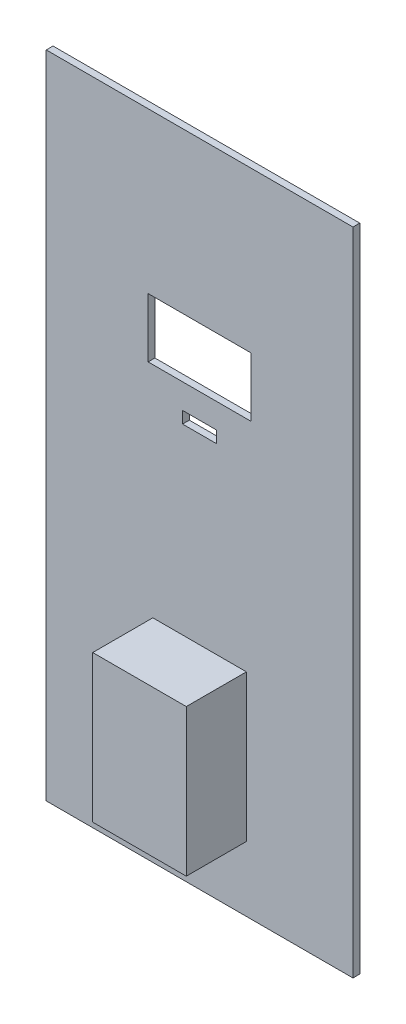
ISO-10303-21;
HEADER;
FILE_DESCRIPTION(('STEP AP214'),'2;1');
FILE_NAME('part.step','',(''),(''),'','','');
FILE_SCHEMA(('AUTOMOTIVE_DESIGN { 1 0 10303 214 1 1 1 1 }'));
ENDSEC;
DATA;
#1=APPLICATION_CONTEXT('core data for automotive mechanical design processes');
#2=APPLICATION_PROTOCOL_DEFINITION('international standard','automotive_design',2000,#1);
#3=PRODUCT_CONTEXT('',#1,'mechanical');
#4=PRODUCT('Part','Part','',(#3));
#5=PRODUCT_RELATED_PRODUCT_CATEGORY('part','',(#4));
#6=PRODUCT_DEFINITION_FORMATION('','',#4);
#7=PRODUCT_DEFINITION_CONTEXT('part definition',#1,'design');
#8=PRODUCT_DEFINITION('design','',#6,#7);
#9=PRODUCT_DEFINITION_SHAPE('','',#8);
#10=(LENGTH_UNIT() NAMED_UNIT(*) SI_UNIT(.MILLI.,.METRE.));
#11=(NAMED_UNIT(*) PLANE_ANGLE_UNIT() SI_UNIT($,.RADIAN.));
#12=(NAMED_UNIT(*) SI_UNIT($,.STERADIAN.) SOLID_ANGLE_UNIT());
#13=UNCERTAINTY_MEASURE_WITH_UNIT(LENGTH_MEASURE(1.E-05),#10,'distance_accuracy_value','');
#14=(GEOMETRIC_REPRESENTATION_CONTEXT(3) GLOBAL_UNCERTAINTY_ASSIGNED_CONTEXT((#13)) GLOBAL_UNIT_ASSIGNED_CONTEXT((#10,
#11,#12)) REPRESENTATION_CONTEXT('',''));
#15=CARTESIAN_POINT('',(0.,0.,0.));
#16=DIRECTION('',(0.,0.,1.));
#17=DIRECTION('',(1.,0.,0.));
#18=AXIS2_PLACEMENT_3D('',#15,#16,#17);
#19=CARTESIAN_POINT('',(0.,0.,12.7));
#20=DIRECTION('',(0.,0.,1.));
#21=DIRECTION('',(1.,0.,0.));
#22=AXIS2_PLACEMENT_3D('',#19,#20,#21);
#23=PLANE('',#22);
#24=DIRECTION('',(0.,1.,0.));
#25=VECTOR('',#24,1.);
#26=CARTESIAN_POINT('',(287.5,609.6,12.7));
#27=LINE('',#26,#25);
#28=CARTESIAN_POINT('',(287.5,-609.6,12.7));
#29=VERTEX_POINT('',#28);
#30=CARTESIAN_POINT('',(287.5,609.6,12.7));
#31=VERTEX_POINT('',#30);
#32=EDGE_CURVE('E307',#29,#31,#27,.T.);
#33=ORIENTED_EDGE('',*,*,#32,.T.);
#34=DIRECTION('',(-1.,0.,0.));
#35=VECTOR('',#34,1.);
#36=CARTESIAN_POINT('',(-287.5,609.6,12.7));
#37=LINE('',#36,#35);
#38=CARTESIAN_POINT('',(-287.5,609.6,12.7));
#39=VERTEX_POINT('',#38);
#40=EDGE_CURVE('E310',#31,#39,#37,.T.);
#41=ORIENTED_EDGE('',*,*,#40,.T.);
#42=DIRECTION('',(0.,-1.,0.));
#43=VECTOR('',#42,1.);
#44=CARTESIAN_POINT('',(-287.5,609.6,12.7));
#45=LINE('',#44,#43);
#46=CARTESIAN_POINT('',(-287.5,-609.6,12.7));
#47=VERTEX_POINT('',#46);
#48=EDGE_CURVE('E313',#39,#47,#45,.T.);
#49=ORIENTED_EDGE('',*,*,#48,.T.);
#50=DIRECTION('',(1.,0.,0.));
#51=VECTOR('',#50,1.);
#52=CARTESIAN_POINT('',(-287.5,-609.6,12.7));
#53=LINE('',#52,#51);
#54=EDGE_CURVE('E315',#47,#29,#53,.T.);
#55=ORIENTED_EDGE('',*,*,#54,.T.);
#56=EDGE_LOOP('',(#33,#41,#49,#55));
#57=FACE_BOUND('',#56,.T.);
#58=DIRECTION('',(0.,-1.,0.));
#59=VECTOR('',#58,1.);
#60=CARTESIAN_POINT('',(-32.,152.128454097859,12.7));
#61=LINE('',#60,#59);
#62=CARTESIAN_POINT('',(-32.,152.128454097859,12.7));
#63=VERTEX_POINT('',#62);
#64=CARTESIAN_POINT('',(-32.,129.938454097859,12.7));
#65=VERTEX_POINT('',#64);
#66=EDGE_CURVE('E237',#63,#65,#61,.T.);
#67=ORIENTED_EDGE('',*,*,#66,.F.);
#68=DIRECTION('',(-1.,0.,0.));
#69=VECTOR('',#68,1.);
#70=CARTESIAN_POINT('',(32.,152.128454097859,12.7));
#71=LINE('',#70,#69);
#72=CARTESIAN_POINT('',(32.,152.128454097859,12.7));
#73=VERTEX_POINT('',#72);
#74=EDGE_CURVE('E281',#73,#63,#71,.T.);
#75=ORIENTED_EDGE('',*,*,#74,.F.);
#76=DIRECTION('',(0.,1.,0.));
#77=VECTOR('',#76,1.);
#78=CARTESIAN_POINT('',(32.,152.128454097859,12.7));
#79=LINE('',#78,#77);
#80=CARTESIAN_POINT('',(32.,129.938454097859,12.7));
#81=VERTEX_POINT('',#80);
#82=EDGE_CURVE('E295',#81,#73,#79,.T.);
#83=ORIENTED_EDGE('',*,*,#82,.F.);
#84=DIRECTION('',(1.,0.,0.));
#85=VECTOR('',#84,1.);
#86=CARTESIAN_POINT('',(32.,129.938454097859,12.7));
#87=LINE('',#86,#85);
#88=EDGE_CURVE('E292',#65,#81,#87,.T.);
#89=ORIENTED_EDGE('',*,*,#88,.F.);
#90=EDGE_LOOP('',(#67,#75,#83,#89));
#91=FACE_BOUND('',#90,.T.);
#92=DIRECTION('',(0.,1.,0.));
#93=VECTOR('',#92,1.);
#94=CARTESIAN_POINT('',(96.5000000000003,309.6,12.7));
#95=LINE('',#94,#93);
#96=CARTESIAN_POINT('',(96.5000000000003,198.6,12.7));
#97=VERTEX_POINT('',#96);
#98=CARTESIAN_POINT('',(96.5000000000003,309.6,12.7));
#99=VERTEX_POINT('',#98);
#100=EDGE_CURVE('E257',#97,#99,#95,.T.);
#101=ORIENTED_EDGE('',*,*,#100,.F.);
#102=DIRECTION('',(1.,0.,0.));
#103=VECTOR('',#102,1.);
#104=CARTESIAN_POINT('',(-96.4999999999997,198.6,12.7));
#105=LINE('',#104,#103);
#106=CARTESIAN_POINT('',(-96.4999999999997,198.6,12.7));
#107=VERTEX_POINT('',#106);
#108=EDGE_CURVE('E247',#107,#97,#105,.T.);
#109=ORIENTED_EDGE('',*,*,#108,.F.);
#110=DIRECTION('',(0.,-1.,0.));
#111=VECTOR('',#110,1.);
#112=CARTESIAN_POINT('',(-96.4999999999997,309.6,12.7));
#113=LINE('',#112,#111);
#114=CARTESIAN_POINT('',(-96.4999999999997,309.6,12.7));
#115=VERTEX_POINT('',#114);
#116=EDGE_CURVE('E263',#115,#107,#113,.T.);
#117=ORIENTED_EDGE('',*,*,#116,.F.);
#118=DIRECTION('',(-1.,0.,0.));
#119=VECTOR('',#118,1.);
#120=CARTESIAN_POINT('',(-96.4999999999997,309.6,12.7));
#121=LINE('',#120,#119);
#122=EDGE_CURVE('E259',#99,#115,#121,.T.);
#123=ORIENTED_EDGE('',*,*,#122,.F.);
#124=EDGE_LOOP('',(#101,#109,#117,#123));
#125=FACE_BOUND('',#124,.T.);
#126=DIRECTION('',(-1.,0.,0.));
#127=VECTOR('',#126,1.);
#128=CARTESIAN_POINT('',(-87.7000000000001,-212.463151910819,12.7));
#129=LINE('',#128,#127);
#130=CARTESIAN_POINT('',(87.6999999999999,-212.463151910819,12.7));
#131=VERTEX_POINT('',#130);
#132=CARTESIAN_POINT('',(-87.7000000000001,-212.463151910819,12.7));
#133=VERTEX_POINT('',#132);
#134=EDGE_CURVE('E214',#131,#133,#129,.T.);
#135=ORIENTED_EDGE('',*,*,#134,.F.);
#136=DIRECTION('',(0.,1.,0.));
#137=VECTOR('',#136,1.);
#138=CARTESIAN_POINT('',(87.6999999999999,-212.463151910819,12.7));
#139=LINE('',#138,#137);
#140=CARTESIAN_POINT('',(87.6999999999999,-487.863151910819,12.7));
#141=VERTEX_POINT('',#140);
#142=EDGE_CURVE('E180',#141,#131,#139,.T.);
#143=ORIENTED_EDGE('',*,*,#142,.F.);
#144=DIRECTION('',(1.,0.,0.));
#145=VECTOR('',#144,1.);
#146=CARTESIAN_POINT('',(87.6999999999999,-487.863151910819,12.7));
#147=LINE('',#146,#145);
#148=CARTESIAN_POINT('',(-87.7000000000001,-487.863151910819,12.7));
#149=VERTEX_POINT('',#148);
#150=EDGE_CURVE('E218',#149,#141,#147,.T.);
#151=ORIENTED_EDGE('',*,*,#150,.F.);
#152=DIRECTION('',(0.,-1.,0.));
#153=VECTOR('',#152,1.);
#154=CARTESIAN_POINT('',(-87.7000000000001,-487.863151910819,12.7));
#155=LINE('',#154,#153);
#156=EDGE_CURVE('E216',#133,#149,#155,.T.);
#157=ORIENTED_EDGE('',*,*,#156,.F.);
#158=EDGE_LOOP('',(#135,#143,#151,#157));
#159=FACE_BOUND('',#158,.T.);
#160=ADVANCED_FACE('F35',(#57,#91,#125,#159),#23,.T.);
#161=CARTESIAN_POINT('',(287.5,609.6,12.7));
#162=DIRECTION('',(-1.,0.,0.));
#163=DIRECTION('',(0.,-1.,0.));
#164=AXIS2_PLACEMENT_3D('',#161,#162,#163);
#165=PLANE('',#164);
#166=DIRECTION('',(0.,1.,0.));
#167=VECTOR('',#166,1.);
#168=CARTESIAN_POINT('',(287.5,609.6,0.));
#169=LINE('',#168,#167);
#170=CARTESIAN_POINT('',(287.5,-609.6,0.));
#171=VERTEX_POINT('',#170);
#172=CARTESIAN_POINT('',(287.5,609.6,0.));
#173=VERTEX_POINT('',#172);
#174=EDGE_CURVE('E270',#171,#173,#169,.T.);
#175=ORIENTED_EDGE('',*,*,#174,.T.);
#176=DIRECTION('',(0.,0.,-1.));
#177=VECTOR('',#176,1.);
#178=CARTESIAN_POINT('',(287.5,609.6,12.7));
#179=LINE('',#178,#177);
#180=EDGE_CURVE('E11',#31,#173,#179,.T.);
#181=ORIENTED_EDGE('',*,*,#180,.F.);
#182=ORIENTED_EDGE('',*,*,#32,.F.);
#183=DIRECTION('',(0.,0.,-1.));
#184=VECTOR('',#183,1.);
#185=CARTESIAN_POINT('',(287.5,-609.6,12.7));
#186=LINE('',#185,#184);
#187=EDGE_CURVE('E317',#29,#171,#186,.T.);
#188=ORIENTED_EDGE('',*,*,#187,.T.);
#189=EDGE_LOOP('',(#175,#181,#182,#188));
#190=FACE_BOUND('',#189,.T.);
#191=ADVANCED_FACE('F37',(#190),#165,.F.);
#192=CARTESIAN_POINT('',(-287.5,609.6,12.7));
#193=DIRECTION('',(0.,-1.,0.));
#194=DIRECTION('',(0.,0.,-1.));
#195=AXIS2_PLACEMENT_3D('',#192,#193,#194);
#196=PLANE('',#195);
#197=DIRECTION('',(-1.,0.,0.));
#198=VECTOR('',#197,1.);
#199=CARTESIAN_POINT('',(-287.5,609.6,0.));
#200=LINE('',#199,#198);
#201=CARTESIAN_POINT('',(-287.5,609.6,0.));
#202=VERTEX_POINT('',#201);
#203=EDGE_CURVE('E320',#173,#202,#200,.T.);
#204=ORIENTED_EDGE('',*,*,#203,.T.);
#205=DIRECTION('',(0.,0.,-1.));
#206=VECTOR('',#205,1.);
#207=CARTESIAN_POINT('',(-287.5,609.6,12.7));
#208=LINE('',#207,#206);
#209=EDGE_CURVE('E43',#39,#202,#208,.T.);
#210=ORIENTED_EDGE('',*,*,#209,.F.);
#211=ORIENTED_EDGE('',*,*,#40,.F.);
#212=ORIENTED_EDGE('',*,*,#180,.T.);
#213=EDGE_LOOP('',(#204,#210,#211,#212));
#214=FACE_BOUND('',#213,.T.);
#215=ADVANCED_FACE('F350',(#214),#196,.F.);
#216=CARTESIAN_POINT('',(-287.5,609.6,12.7));
#217=DIRECTION('',(1.,0.,0.));
#218=DIRECTION('',(0.,1.,0.));
#219=AXIS2_PLACEMENT_3D('',#216,#217,#218);
#220=PLANE('',#219);
#221=DIRECTION('',(0.,-1.,0.));
#222=VECTOR('',#221,1.);
#223=CARTESIAN_POINT('',(-287.5,609.6,0.));
#224=LINE('',#223,#222);
#225=CARTESIAN_POINT('',(-287.5,-609.6,0.));
#226=VERTEX_POINT('',#225);
#227=EDGE_CURVE('E322',#202,#226,#224,.T.);
#228=ORIENTED_EDGE('',*,*,#227,.T.);
#229=DIRECTION('',(0.,0.,-1.));
#230=VECTOR('',#229,1.);
#231=CARTESIAN_POINT('',(-287.5,-609.6,12.7));
#232=LINE('',#231,#230);
#233=EDGE_CURVE('E327',#47,#226,#232,.T.);
#234=ORIENTED_EDGE('',*,*,#233,.F.);
#235=ORIENTED_EDGE('',*,*,#48,.F.);
#236=ORIENTED_EDGE('',*,*,#209,.T.);
#237=EDGE_LOOP('',(#228,#234,#235,#236));
#238=FACE_BOUND('',#237,.T.);
#239=ADVANCED_FACE('F334',(#238),#220,.F.);
#240=CARTESIAN_POINT('',(-287.5,-609.6,12.7));
#241=DIRECTION('',(0.,1.,0.));
#242=DIRECTION('',(0.,0.,1.));
#243=AXIS2_PLACEMENT_3D('',#240,#241,#242);
#244=PLANE('',#243);
#245=DIRECTION('',(1.,0.,0.));
#246=VECTOR('',#245,1.);
#247=CARTESIAN_POINT('',(-287.5,-609.6,0.));
#248=LINE('',#247,#246);
#249=EDGE_CURVE('E311',#226,#171,#248,.T.);
#250=ORIENTED_EDGE('',*,*,#249,.T.);
#251=ORIENTED_EDGE('',*,*,#187,.F.);
#252=ORIENTED_EDGE('',*,*,#54,.F.);
#253=ORIENTED_EDGE('',*,*,#233,.T.);
#254=EDGE_LOOP('',(#250,#251,#252,#253));
#255=FACE_BOUND('',#254,.T.);
#256=ADVANCED_FACE('F343',(#255),#244,.F.);
#257=CARTESIAN_POINT('',(0.,0.,0.));
#258=DIRECTION('',(0.,0.,1.));
#259=DIRECTION('',(1.,0.,0.));
#260=AXIS2_PLACEMENT_3D('',#257,#258,#259);
#261=PLANE('',#260);
#262=DIRECTION('',(1.,0.,0.));
#263=VECTOR('',#262,1.);
#264=CARTESIAN_POINT('',(74.9999999999999,-225.163151910819,0.));
#265=LINE('',#264,#263);
#266=CARTESIAN_POINT('',(-75.0000000000001,-225.163151910819,0.));
#267=VERTEX_POINT('',#266);
#268=CARTESIAN_POINT('',(74.9999999999999,-225.163151910819,0.));
#269=VERTEX_POINT('',#268);
#270=EDGE_CURVE('E225',#267,#269,#265,.T.);
#271=ORIENTED_EDGE('',*,*,#270,.F.);
#272=DIRECTION('',(0.,1.,0.));
#273=VECTOR('',#272,1.);
#274=CARTESIAN_POINT('',(-75.0000000000001,-225.163151910819,0.));
#275=LINE('',#274,#273);
#276=CARTESIAN_POINT('',(-75.0000000000001,-475.163151910819,0.));
#277=VERTEX_POINT('',#276);
#278=EDGE_CURVE('E58',#277,#267,#275,.T.);
#279=ORIENTED_EDGE('',*,*,#278,.F.);
#280=DIRECTION('',(-1.,0.,0.));
#281=VECTOR('',#280,1.);
#282=CARTESIAN_POINT('',(74.9999999999999,-475.163151910819,0.));
#283=LINE('',#282,#281);
#284=CARTESIAN_POINT('',(74.9999999999999,-475.163151910819,0.));
#285=VERTEX_POINT('',#284);
#286=EDGE_CURVE('E231',#285,#277,#283,.T.);
#287=ORIENTED_EDGE('',*,*,#286,.F.);
#288=DIRECTION('',(0.,-1.,0.));
#289=VECTOR('',#288,1.);
#290=CARTESIAN_POINT('',(74.9999999999999,-225.163151910819,0.));
#291=LINE('',#290,#289);
#292=EDGE_CURVE('E228',#269,#285,#291,.T.);
#293=ORIENTED_EDGE('',*,*,#292,.F.);
#294=EDGE_LOOP('',(#271,#279,#287,#293));
#295=FACE_BOUND('',#294,.T.);
#296=DIRECTION('',(1.,0.,0.));
#297=VECTOR('',#296,1.);
#298=CARTESIAN_POINT('',(-96.4999999999997,198.6,0.));
#299=LINE('',#298,#297);
#300=CARTESIAN_POINT('',(-96.4999999999997,198.6,0.));
#301=VERTEX_POINT('',#300);
#302=CARTESIAN_POINT('',(96.5000000000003,198.6,0.));
#303=VERTEX_POINT('',#302);
#304=EDGE_CURVE('E253',#301,#303,#299,.T.);
#305=ORIENTED_EDGE('',*,*,#304,.T.);
#306=DIRECTION('',(0.,1.,0.));
#307=VECTOR('',#306,1.);
#308=CARTESIAN_POINT('',(96.5000000000003,309.6,0.));
#309=LINE('',#308,#307);
#310=CARTESIAN_POINT('',(96.5000000000003,309.6,0.));
#311=VERTEX_POINT('',#310);
#312=EDGE_CURVE('E243',#303,#311,#309,.T.);
#313=ORIENTED_EDGE('',*,*,#312,.T.);
#314=DIRECTION('',(-1.,0.,0.));
#315=VECTOR('',#314,1.);
#316=CARTESIAN_POINT('',(-96.4999999999997,309.6,0.));
#317=LINE('',#316,#315);
#318=CARTESIAN_POINT('',(-96.4999999999997,309.6,0.));
#319=VERTEX_POINT('',#318);
#320=EDGE_CURVE('E246',#311,#319,#317,.T.);
#321=ORIENTED_EDGE('',*,*,#320,.T.);
#322=DIRECTION('',(0.,-1.,0.));
#323=VECTOR('',#322,1.);
#324=CARTESIAN_POINT('',(-96.4999999999997,309.6,0.));
#325=LINE('',#324,#323);
#326=EDGE_CURVE('E250',#319,#301,#325,.T.);
#327=ORIENTED_EDGE('',*,*,#326,.T.);
#328=EDGE_LOOP('',(#305,#313,#321,#327));
#329=FACE_BOUND('',#328,.T.);
#330=DIRECTION('',(-1.,0.,0.));
#331=VECTOR('',#330,1.);
#332=CARTESIAN_POINT('',(32.,152.128454097859,0.));
#333=LINE('',#332,#331);
#334=CARTESIAN_POINT('',(32.,152.128454097859,0.));
#335=VERTEX_POINT('',#334);
#336=CARTESIAN_POINT('',(-32.,152.128454097859,0.));
#337=VERTEX_POINT('',#336);
#338=EDGE_CURVE('E287',#335,#337,#333,.T.);
#339=ORIENTED_EDGE('',*,*,#338,.T.);
#340=DIRECTION('',(0.,-1.,0.));
#341=VECTOR('',#340,1.);
#342=CARTESIAN_POINT('',(-32.,152.128454097859,0.));
#343=LINE('',#342,#341);
#344=CARTESIAN_POINT('',(-32.,129.938454097859,0.));
#345=VERTEX_POINT('',#344);
#346=EDGE_CURVE('E277',#337,#345,#343,.T.);
#347=ORIENTED_EDGE('',*,*,#346,.T.);
#348=DIRECTION('',(1.,0.,0.));
#349=VECTOR('',#348,1.);
#350=CARTESIAN_POINT('',(32.,129.938454097859,0.));
#351=LINE('',#350,#349);
#352=CARTESIAN_POINT('',(32.,129.938454097859,0.));
#353=VERTEX_POINT('',#352);
#354=EDGE_CURVE('E280',#345,#353,#351,.T.);
#355=ORIENTED_EDGE('',*,*,#354,.T.);
#356=DIRECTION('',(0.,1.,0.));
#357=VECTOR('',#356,1.);
#358=CARTESIAN_POINT('',(32.,152.128454097859,0.));
#359=LINE('',#358,#357);
#360=EDGE_CURVE('E284',#353,#335,#359,.T.);
#361=ORIENTED_EDGE('',*,*,#360,.T.);
#362=EDGE_LOOP('',(#339,#347,#355,#361));
#363=FACE_BOUND('',#362,.T.);
#364=ORIENTED_EDGE('',*,*,#174,.F.);
#365=ORIENTED_EDGE('',*,*,#249,.F.);
#366=ORIENTED_EDGE('',*,*,#227,.F.);
#367=ORIENTED_EDGE('',*,*,#203,.F.);
#368=EDGE_LOOP('',(#364,#365,#366,#367));
#369=FACE_BOUND('',#368,.T.);
#370=ADVANCED_FACE('F340',(#295,#329,#363,#369),#261,.F.);
#371=CARTESIAN_POINT('',(-32.,152.128454097859,0.));
#372=DIRECTION('',(-1.,0.,0.));
#373=DIRECTION('',(0.,0.,1.));
#374=AXIS2_PLACEMENT_3D('',#371,#372,#373);
#375=PLANE('',#374);
#376=ORIENTED_EDGE('',*,*,#66,.T.);
#377=DIRECTION('',(0.,0.,1.));
#378=VECTOR('',#377,1.);
#379=CARTESIAN_POINT('',(-32.,129.938454097859,0.));
#380=LINE('',#379,#378);
#381=EDGE_CURVE('E290',#345,#65,#380,.T.);
#382=ORIENTED_EDGE('',*,*,#381,.F.);
#383=ORIENTED_EDGE('',*,*,#346,.F.);
#384=DIRECTION('',(0.,0.,1.));
#385=VECTOR('',#384,1.);
#386=CARTESIAN_POINT('',(-32.,152.128454097859,0.));
#387=LINE('',#386,#385);
#388=EDGE_CURVE('E260',#337,#63,#387,.T.);
#389=ORIENTED_EDGE('',*,*,#388,.T.);
#390=EDGE_LOOP('',(#376,#382,#383,#389));
#391=FACE_BOUND('',#390,.T.);
#392=ADVANCED_FACE('F365',(#391),#375,.F.);
#393=CARTESIAN_POINT('',(32.,152.128454097859,0.));
#394=DIRECTION('',(0.,1.,0.));
#395=DIRECTION('',(0.,0.,1.));
#396=AXIS2_PLACEMENT_3D('',#393,#394,#395);
#397=PLANE('',#396);
#398=ORIENTED_EDGE('',*,*,#74,.T.);
#399=ORIENTED_EDGE('',*,*,#388,.F.);
#400=ORIENTED_EDGE('',*,*,#338,.F.);
#401=DIRECTION('',(0.,0.,1.));
#402=VECTOR('',#401,1.);
#403=CARTESIAN_POINT('',(32.,152.128454097859,0.));
#404=LINE('',#403,#402);
#405=EDGE_CURVE('E301',#335,#73,#404,.T.);
#406=ORIENTED_EDGE('',*,*,#405,.T.);
#407=EDGE_LOOP('',(#398,#399,#400,#406));
#408=FACE_BOUND('',#407,.T.);
#409=ADVANCED_FACE('F394',(#408),#397,.F.);
#410=CARTESIAN_POINT('',(32.,152.128454097859,0.));
#411=DIRECTION('',(1.,0.,0.));
#412=DIRECTION('',(0.,1.,0.));
#413=AXIS2_PLACEMENT_3D('',#410,#411,#412);
#414=PLANE('',#413);
#415=ORIENTED_EDGE('',*,*,#82,.T.);
#416=ORIENTED_EDGE('',*,*,#405,.F.);
#417=ORIENTED_EDGE('',*,*,#360,.F.);
#418=DIRECTION('',(0.,0.,1.));
#419=VECTOR('',#418,1.);
#420=CARTESIAN_POINT('',(32.,129.938454097859,0.));
#421=LINE('',#420,#419);
#422=EDGE_CURVE('E303',#353,#81,#421,.T.);
#423=ORIENTED_EDGE('',*,*,#422,.T.);
#424=EDGE_LOOP('',(#415,#416,#417,#423));
#425=FACE_BOUND('',#424,.T.);
#426=ADVANCED_FACE('F400',(#425),#414,.F.);
#427=CARTESIAN_POINT('',(32.,129.938454097859,0.));
#428=DIRECTION('',(0.,-1.,0.));
#429=DIRECTION('',(0.,0.,-1.));
#430=AXIS2_PLACEMENT_3D('',#427,#428,#429);
#431=PLANE('',#430);
#432=ORIENTED_EDGE('',*,*,#88,.T.);
#433=ORIENTED_EDGE('',*,*,#422,.F.);
#434=ORIENTED_EDGE('',*,*,#354,.F.);
#435=ORIENTED_EDGE('',*,*,#381,.T.);
#436=EDGE_LOOP('',(#432,#433,#434,#435));
#437=FACE_BOUND('',#436,.T.);
#438=ADVANCED_FACE('F408',(#437),#431,.F.);
#439=CARTESIAN_POINT('',(96.5000000000003,309.6,0.));
#440=DIRECTION('',(1.,0.,0.));
#441=DIRECTION('',(0.,1.,0.));
#442=AXIS2_PLACEMENT_3D('',#439,#440,#441);
#443=PLANE('',#442);
#444=ORIENTED_EDGE('',*,*,#100,.T.);
#445=DIRECTION('',(0.,0.,1.));
#446=VECTOR('',#445,1.);
#447=CARTESIAN_POINT('',(96.5000000000003,309.6,0.));
#448=LINE('',#447,#446);
#449=EDGE_CURVE('E256',#311,#99,#448,.T.);
#450=ORIENTED_EDGE('',*,*,#449,.F.);
#451=ORIENTED_EDGE('',*,*,#312,.F.);
#452=DIRECTION('',(0.,0.,1.));
#453=VECTOR('',#452,1.);
#454=CARTESIAN_POINT('',(96.5000000000003,198.6,0.));
#455=LINE('',#454,#453);
#456=EDGE_CURVE('E268',#303,#97,#455,.T.);
#457=ORIENTED_EDGE('',*,*,#456,.T.);
#458=EDGE_LOOP('',(#444,#450,#451,#457));
#459=FACE_BOUND('',#458,.T.);
#460=ADVANCED_FACE('F416',(#459),#443,.F.);
#461=CARTESIAN_POINT('',(-96.4999999999997,198.6,0.));
#462=DIRECTION('',(0.,-1.,0.));
#463=DIRECTION('',(0.,0.,-1.));
#464=AXIS2_PLACEMENT_3D('',#461,#462,#463);
#465=PLANE('',#464);
#466=ORIENTED_EDGE('',*,*,#108,.T.);
#467=ORIENTED_EDGE('',*,*,#456,.F.);
#468=ORIENTED_EDGE('',*,*,#304,.F.);
#469=DIRECTION('',(0.,0.,1.));
#470=VECTOR('',#469,1.);
#471=CARTESIAN_POINT('',(-96.4999999999997,198.6,0.));
#472=LINE('',#471,#470);
#473=EDGE_CURVE('E271',#301,#107,#472,.T.);
#474=ORIENTED_EDGE('',*,*,#473,.T.);
#475=EDGE_LOOP('',(#466,#467,#468,#474));
#476=FACE_BOUND('',#475,.T.);
#477=ADVANCED_FACE('F423',(#476),#465,.F.);
#478=CARTESIAN_POINT('',(-96.4999999999997,309.6,0.));
#479=DIRECTION('',(-1.,0.,0.));
#480=DIRECTION('',(0.,-1.,0.));
#481=AXIS2_PLACEMENT_3D('',#478,#479,#480);
#482=PLANE('',#481);
#483=ORIENTED_EDGE('',*,*,#116,.T.);
#484=ORIENTED_EDGE('',*,*,#473,.F.);
#485=ORIENTED_EDGE('',*,*,#326,.F.);
#486=DIRECTION('',(0.,0.,1.));
#487=VECTOR('',#486,1.);
#488=CARTESIAN_POINT('',(-96.4999999999997,309.6,0.));
#489=LINE('',#488,#487);
#490=EDGE_CURVE('E273',#319,#115,#489,.T.);
#491=ORIENTED_EDGE('',*,*,#490,.T.);
#492=EDGE_LOOP('',(#483,#484,#485,#491));
#493=FACE_BOUND('',#492,.T.);
#494=ADVANCED_FACE('F431',(#493),#482,.F.);
#495=CARTESIAN_POINT('',(-96.4999999999997,309.6,0.));
#496=DIRECTION('',(0.,1.,0.));
#497=DIRECTION('',(0.,0.,1.));
#498=AXIS2_PLACEMENT_3D('',#495,#496,#497);
#499=PLANE('',#498);
#500=ORIENTED_EDGE('',*,*,#122,.T.);
#501=ORIENTED_EDGE('',*,*,#490,.F.);
#502=ORIENTED_EDGE('',*,*,#320,.F.);
#503=ORIENTED_EDGE('',*,*,#449,.T.);
#504=EDGE_LOOP('',(#500,#501,#502,#503));
#505=FACE_BOUND('',#504,.T.);
#506=ADVANCED_FACE('F439',(#505),#499,.F.);
#507=CARTESIAN_POINT('',(-75.0000000000001,-225.163151910819,12.7));
#508=DIRECTION('',(-1.,0.,0.));
#509=DIRECTION('',(0.,-1.,0.));
#510=AXIS2_PLACEMENT_3D('',#507,#508,#509);
#511=PLANE('',#510);
#512=ORIENTED_EDGE('',*,*,#278,.T.);
#513=DIRECTION('',(0.,0.,-1.));
#514=VECTOR('',#513,1.);
#515=CARTESIAN_POINT('',(-75.0000000000001,-225.163151910819,12.7));
#516=LINE('',#515,#514);
#517=CARTESIAN_POINT('',(-75.0000000000001,-225.163151910819,112.7));
#518=VERTEX_POINT('',#517);
#519=EDGE_CURVE('E234',#518,#267,#516,.T.);
#520=ORIENTED_EDGE('',*,*,#519,.F.);
#521=DIRECTION('',(0.,-1.,0.));
#522=VECTOR('',#521,1.);
#523=CARTESIAN_POINT('',(-75.0000000000001,-475.163151910819,112.7));
#524=LINE('',#523,#522);
#525=CARTESIAN_POINT('',(-75.0000000000001,-475.163151910819,112.7));
#526=VERTEX_POINT('',#525);
#527=EDGE_CURVE('E207',#518,#526,#524,.T.);
#528=ORIENTED_EDGE('',*,*,#527,.T.);
#529=DIRECTION('',(0.,0.,-1.));
#530=VECTOR('',#529,1.);
#531=CARTESIAN_POINT('',(-75.0000000000001,-475.163151910819,12.7));
#532=LINE('',#531,#530);
#533=EDGE_CURVE('E235',#526,#277,#532,.T.);
#534=ORIENTED_EDGE('',*,*,#533,.T.);
#535=EDGE_LOOP('',(#512,#520,#528,#534));
#536=FACE_BOUND('',#535,.T.);
#537=ADVANCED_FACE('F446',(#536),#511,.F.);
#538=CARTESIAN_POINT('',(74.9999999999999,-475.163151910819,12.7));
#539=DIRECTION('',(0.,-1.,0.));
#540=DIRECTION('',(0.,0.,-1.));
#541=AXIS2_PLACEMENT_3D('',#538,#539,#540);
#542=PLANE('',#541);
#543=ORIENTED_EDGE('',*,*,#286,.T.);
#544=ORIENTED_EDGE('',*,*,#533,.F.);
#545=DIRECTION('',(1.,0.,0.));
#546=VECTOR('',#545,1.);
#547=CARTESIAN_POINT('',(74.9999999999999,-475.163151910819,112.7));
#548=LINE('',#547,#546);
#549=CARTESIAN_POINT('',(74.9999999999999,-475.163151910819,112.7));
#550=VERTEX_POINT('',#549);
#551=EDGE_CURVE('E210',#526,#550,#548,.T.);
#552=ORIENTED_EDGE('',*,*,#551,.T.);
#553=DIRECTION('',(0.,0.,-1.));
#554=VECTOR('',#553,1.);
#555=CARTESIAN_POINT('',(74.9999999999999,-475.163151910819,12.7));
#556=LINE('',#555,#554);
#557=EDGE_CURVE('E238',#550,#285,#556,.T.);
#558=ORIENTED_EDGE('',*,*,#557,.T.);
#559=EDGE_LOOP('',(#543,#544,#552,#558));
#560=FACE_BOUND('',#559,.T.);
#561=ADVANCED_FACE('F453',(#560),#542,.F.);
#562=CARTESIAN_POINT('',(74.9999999999999,-225.163151910819,12.7));
#563=DIRECTION('',(1.,0.,0.));
#564=DIRECTION('',(0.,1.,0.));
#565=AXIS2_PLACEMENT_3D('',#562,#563,#564);
#566=PLANE('',#565);
#567=ORIENTED_EDGE('',*,*,#292,.T.);
#568=ORIENTED_EDGE('',*,*,#557,.F.);
#569=DIRECTION('',(0.,1.,0.));
#570=VECTOR('',#569,1.);
#571=CARTESIAN_POINT('',(74.9999999999999,-225.163151910819,112.7));
#572=LINE('',#571,#570);
#573=CARTESIAN_POINT('',(74.9999999999999,-225.163151910819,112.7));
#574=VERTEX_POINT('',#573);
#575=EDGE_CURVE('E201',#550,#574,#572,.T.);
#576=ORIENTED_EDGE('',*,*,#575,.T.);
#577=DIRECTION('',(0.,0.,-1.));
#578=VECTOR('',#577,1.);
#579=CARTESIAN_POINT('',(74.9999999999999,-225.163151910819,12.7));
#580=LINE('',#579,#578);
#581=EDGE_CURVE('E240',#574,#269,#580,.T.);
#582=ORIENTED_EDGE('',*,*,#581,.T.);
#583=EDGE_LOOP('',(#567,#568,#576,#582));
#584=FACE_BOUND('',#583,.T.);
#585=ADVANCED_FACE('F459',(#584),#566,.F.);
#586=CARTESIAN_POINT('',(74.9999999999999,-225.163151910819,12.7));
#587=DIRECTION('',(0.,1.,0.));
#588=DIRECTION('',(-1.,0.,0.));
#589=AXIS2_PLACEMENT_3D('',#586,#587,#588);
#590=PLANE('',#589);
#591=ORIENTED_EDGE('',*,*,#270,.T.);
#592=ORIENTED_EDGE('',*,*,#581,.F.);
#593=DIRECTION('',(-1.,0.,0.));
#594=VECTOR('',#593,1.);
#595=CARTESIAN_POINT('',(-75.0000000000001,-225.163151910819,112.7));
#596=LINE('',#595,#594);
#597=EDGE_CURVE('E204',#574,#518,#596,.T.);
#598=ORIENTED_EDGE('',*,*,#597,.T.);
#599=ORIENTED_EDGE('',*,*,#519,.T.);
#600=EDGE_LOOP('',(#591,#592,#598,#599));
#601=FACE_BOUND('',#600,.T.);
#602=ADVANCED_FACE('F467',(#601),#590,.F.);
#603=CARTESIAN_POINT('',(87.6999999999999,-212.463151910819,112.7));
#604=DIRECTION('',(-1.,0.,0.));
#605=DIRECTION('',(0.,0.,1.));
#606=AXIS2_PLACEMENT_3D('',#603,#604,#605);
#607=PLANE('',#606);
#608=ORIENTED_EDGE('',*,*,#142,.T.);
#609=DIRECTION('',(0.,0.,-1.));
#610=VECTOR('',#609,1.);
#611=CARTESIAN_POINT('',(87.6999999999999,-212.463151910819,112.7));
#612=LINE('',#611,#610);
#613=CARTESIAN_POINT('',(87.6999999999999,-212.463151910819,125.4));
#614=VERTEX_POINT('',#613);
#615=EDGE_CURVE('E173',#614,#131,#612,.T.);
#616=ORIENTED_EDGE('',*,*,#615,.F.);
#617=DIRECTION('',(0.,1.,0.));
#618=VECTOR('',#617,1.);
#619=CARTESIAN_POINT('',(87.6999999999999,-487.863151910819,125.4));
#620=LINE('',#619,#618);
#621=CARTESIAN_POINT('',(87.6999999999999,-487.863151910819,125.4));
#622=VERTEX_POINT('',#621);
#623=EDGE_CURVE('E178',#622,#614,#620,.T.);
#624=ORIENTED_EDGE('',*,*,#623,.F.);
#625=DIRECTION('',(0.,0.,-1.));
#626=VECTOR('',#625,1.);
#627=CARTESIAN_POINT('',(87.6999999999999,-487.863151910819,112.7));
#628=LINE('',#627,#626);
#629=EDGE_CURVE('E220',#622,#141,#628,.T.);
#630=ORIENTED_EDGE('',*,*,#629,.T.);
#631=EDGE_LOOP('',(#608,#616,#624,#630));
#632=FACE_BOUND('',#631,.T.);
#633=ADVANCED_FACE('F175',(#632),#607,.F.);
#634=CARTESIAN_POINT('',(-87.7000000000001,-212.463151910819,112.7));
#635=DIRECTION('',(0.,-1.,0.));
#636=DIRECTION('',(0.,0.,-1.));
#637=AXIS2_PLACEMENT_3D('',#634,#635,#636);
#638=PLANE('',#637);
#639=ORIENTED_EDGE('',*,*,#134,.T.);
#640=DIRECTION('',(0.,0.,-1.));
#641=VECTOR('',#640,1.);
#642=CARTESIAN_POINT('',(-87.7000000000001,-212.463151910819,112.7));
#643=LINE('',#642,#641);
#644=CARTESIAN_POINT('',(-87.7000000000001,-212.463151910819,125.4));
#645=VERTEX_POINT('',#644);
#646=EDGE_CURVE('E183',#645,#133,#643,.T.);
#647=ORIENTED_EDGE('',*,*,#646,.F.);
#648=DIRECTION('',(-1.,0.,0.));
#649=VECTOR('',#648,1.);
#650=CARTESIAN_POINT('',(87.6999999999999,-212.463151910819,125.4));
#651=LINE('',#650,#649);
#652=EDGE_CURVE('E186',#614,#645,#651,.T.);
#653=ORIENTED_EDGE('',*,*,#652,.F.);
#654=ORIENTED_EDGE('',*,*,#615,.T.);
#655=EDGE_LOOP('',(#639,#647,#653,#654));
#656=FACE_BOUND('',#655,.T.);
#657=ADVANCED_FACE('F187',(#656),#638,.F.);
#658=CARTESIAN_POINT('',(-87.7000000000001,-487.863151910819,112.7));
#659=DIRECTION('',(1.,0.,0.));
#660=DIRECTION('',(0.,0.,-1.));
#661=AXIS2_PLACEMENT_3D('',#658,#659,#660);
#662=PLANE('',#661);
#663=ORIENTED_EDGE('',*,*,#156,.T.);
#664=DIRECTION('',(0.,0.,-1.));
#665=VECTOR('',#664,1.);
#666=CARTESIAN_POINT('',(-87.7000000000001,-487.863151910819,112.7));
#667=LINE('',#666,#665);
#668=CARTESIAN_POINT('',(-87.7000000000001,-487.863151910819,125.4));
#669=VERTEX_POINT('',#668);
#670=EDGE_CURVE('E50',#669,#149,#667,.T.);
#671=ORIENTED_EDGE('',*,*,#670,.F.);
#672=DIRECTION('',(0.,-1.,0.));
#673=VECTOR('',#672,1.);
#674=CARTESIAN_POINT('',(-87.7000000000001,-487.863151910819,125.4));
#675=LINE('',#674,#673);
#676=EDGE_CURVE('E192',#645,#669,#675,.T.);
#677=ORIENTED_EDGE('',*,*,#676,.F.);
#678=ORIENTED_EDGE('',*,*,#646,.T.);
#679=EDGE_LOOP('',(#663,#671,#677,#678));
#680=FACE_BOUND('',#679,.T.);
#681=ADVANCED_FACE('F488',(#680),#662,.F.);
#682=CARTESIAN_POINT('',(87.6999999999999,-487.863151910819,112.7));
#683=DIRECTION('',(0.,1.,0.));
#684=DIRECTION('',(0.,0.,1.));
#685=AXIS2_PLACEMENT_3D('',#682,#683,#684);
#686=PLANE('',#685);
#687=ORIENTED_EDGE('',*,*,#150,.T.);
#688=ORIENTED_EDGE('',*,*,#629,.F.);
#689=DIRECTION('',(1.,0.,0.));
#690=VECTOR('',#689,1.);
#691=CARTESIAN_POINT('',(87.6999999999999,-487.863151910819,125.4));
#692=LINE('',#691,#690);
#693=EDGE_CURVE('E196',#669,#622,#692,.T.);
#694=ORIENTED_EDGE('',*,*,#693,.F.);
#695=ORIENTED_EDGE('',*,*,#670,.T.);
#696=EDGE_LOOP('',(#687,#688,#694,#695));
#697=FACE_BOUND('',#696,.T.);
#698=ADVANCED_FACE('F495',(#697),#686,.F.);
#699=CARTESIAN_POINT('',(0.,0.,112.7));
#700=DIRECTION('',(0.,0.,1.));
#701=DIRECTION('',(1.,0.,0.));
#702=AXIS2_PLACEMENT_3D('',#699,#700,#701);
#703=PLANE('',#702);
#704=ORIENTED_EDGE('',*,*,#575,.F.);
#705=ORIENTED_EDGE('',*,*,#551,.F.);
#706=ORIENTED_EDGE('',*,*,#527,.F.);
#707=ORIENTED_EDGE('',*,*,#597,.F.);
#708=EDGE_LOOP('',(#704,#705,#706,#707));
#709=FACE_BOUND('',#708,.T.);
#710=ADVANCED_FACE('F503',(#709),#703,.F.);
#711=CARTESIAN_POINT('',(0.,0.,125.4));
#712=DIRECTION('',(0.,0.,1.));
#713=DIRECTION('',(1.,0.,0.));
#714=AXIS2_PLACEMENT_3D('',#711,#712,#713);
#715=PLANE('',#714);
#716=ORIENTED_EDGE('',*,*,#623,.T.);
#717=ORIENTED_EDGE('',*,*,#652,.T.);
#718=ORIENTED_EDGE('',*,*,#676,.T.);
#719=ORIENTED_EDGE('',*,*,#693,.T.);
#720=EDGE_LOOP('',(#716,#717,#718,#719));
#721=FACE_BOUND('',#720,.T.);
#722=ADVANCED_FACE('F195',(#721),#715,.T.);
#723=CLOSED_SHELL('',(#160,#191,#215,#239,#256,#370,#392,#409,#426,#438,#460,#477,#494,#506,
#537,#561,#585,#602,#633,#657,#681,#698,#710,#722));
#724=MANIFOLD_SOLID_BREP('B2',#723);
#725=ADVANCED_BREP_SHAPE_REPRESENTATION('',(#18,#724),#14);
#726=SHAPE_DEFINITION_REPRESENTATION(#9,#725);
ENDSEC;
END-ISO-10303-21;
